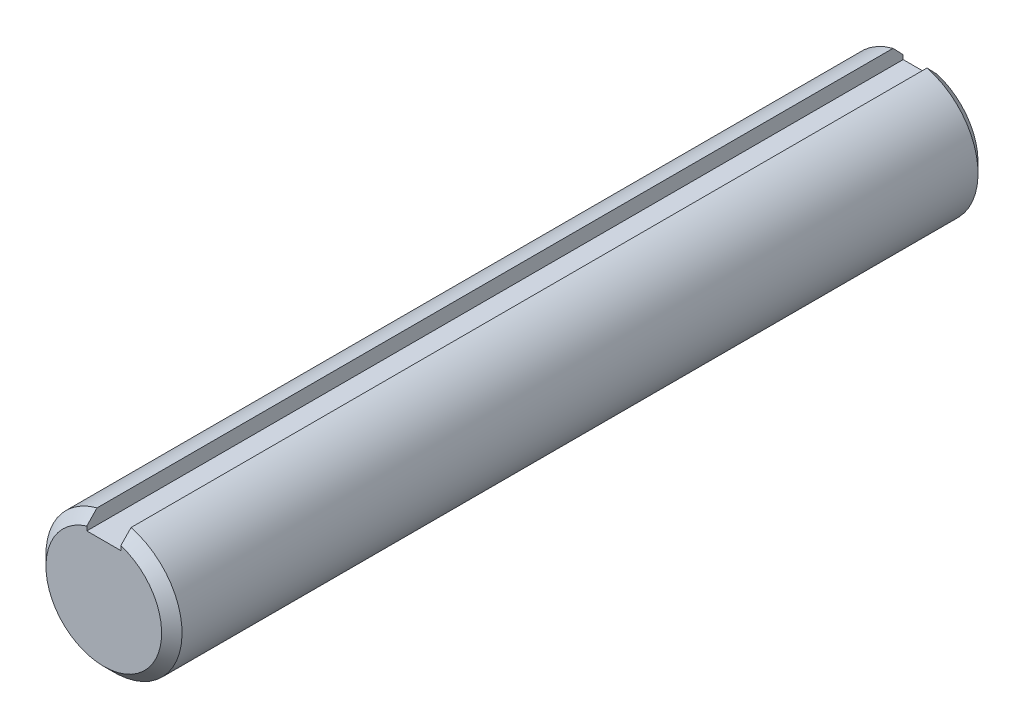
ISO-10303-21;
HEADER;
FILE_DESCRIPTION(('STEP AP214'),'2;1');
FILE_NAME('part.step','',(''),(''),'','','');
FILE_SCHEMA(('AUTOMOTIVE_DESIGN { 1 0 10303 214 1 1 1 1 }'));
ENDSEC;
DATA;
#1=APPLICATION_CONTEXT('core data for automotive mechanical design processes');
#2=APPLICATION_PROTOCOL_DEFINITION('international standard','automotive_design',2000,#1);
#3=PRODUCT_CONTEXT('',#1,'mechanical');
#4=PRODUCT('Part','Part','',(#3));
#5=PRODUCT_RELATED_PRODUCT_CATEGORY('part','',(#4));
#6=PRODUCT_DEFINITION_FORMATION('','',#4);
#7=PRODUCT_DEFINITION_CONTEXT('part definition',#1,'design');
#8=PRODUCT_DEFINITION('design','',#6,#7);
#9=PRODUCT_DEFINITION_SHAPE('','',#8);
#10=(LENGTH_UNIT() NAMED_UNIT(*) SI_UNIT(.MILLI.,.METRE.));
#11=(NAMED_UNIT(*) PLANE_ANGLE_UNIT() SI_UNIT($,.RADIAN.));
#12=(NAMED_UNIT(*) SI_UNIT($,.STERADIAN.) SOLID_ANGLE_UNIT());
#13=UNCERTAINTY_MEASURE_WITH_UNIT(LENGTH_MEASURE(1.E-05),#10,'distance_accuracy_value','');
#14=(GEOMETRIC_REPRESENTATION_CONTEXT(3) GLOBAL_UNCERTAINTY_ASSIGNED_CONTEXT((#13)) GLOBAL_UNIT_ASSIGNED_CONTEXT((#10,
#11,#12)) REPRESENTATION_CONTEXT('',''));
#15=CARTESIAN_POINT('',(0.,0.,0.));
#16=DIRECTION('',(0.,0.,1.));
#17=DIRECTION('',(1.,0.,0.));
#18=AXIS2_PLACEMENT_3D('',#15,#16,#17);
#19=CARTESIAN_POINT('',(0.,0.,76.2));
#20=DIRECTION('',(0.,0.,-1.));
#21=DIRECTION('',(-1.,0.,0.));
#22=AXIS2_PLACEMENT_3D('',#19,#20,#21);
#23=CYLINDRICAL_SURFACE('',#22,12.7);
#24=CARTESIAN_POINT('',(0.,0.,74.2950000000001));
#25=DIRECTION('',(0.,0.,1.));
#26=DIRECTION('',(1.,0.,0.));
#27=AXIS2_PLACEMENT_3D('',#24,#25,#26);
#28=CIRCLE('',#27,12.7);
#29=CARTESIAN_POINT('',(3.175,12.2967221242085,74.2950000000001));
#30=VERTEX_POINT('',#29);
#31=CARTESIAN_POINT('',(-3.175,12.2967221242085,74.2950000000001));
#32=VERTEX_POINT('',#31);
#33=EDGE_CURVE('E155',#30,#32,#28,.F.);
#34=ORIENTED_EDGE('',*,*,#33,.T.);
#35=DIRECTION('',(0.,0.,-1.));
#36=VECTOR('',#35,1.);
#37=CARTESIAN_POINT('',(-3.175,12.2967221242085,76.2));
#38=LINE('',#37,#36);
#39=CARTESIAN_POINT('',(-3.175,12.2967221242085,-74.2949999999998));
#40=VERTEX_POINT('',#39);
#41=EDGE_CURVE('E132',#32,#40,#38,.T.);
#42=ORIENTED_EDGE('',*,*,#41,.T.);
#43=CARTESIAN_POINT('',(0.,0.,-74.2949999999998));
#44=DIRECTION('',(0.,0.,1.));
#45=DIRECTION('',(1.,0.,0.));
#46=AXIS2_PLACEMENT_3D('',#43,#44,#45);
#47=CIRCLE('',#46,12.7);
#48=CARTESIAN_POINT('',(3.175,12.2967221242085,-74.2949999999998));
#49=VERTEX_POINT('',#48);
#50=EDGE_CURVE('E152',#40,#49,#47,.T.);
#51=ORIENTED_EDGE('',*,*,#50,.T.);
#52=DIRECTION('',(0.,0.,-1.));
#53=VECTOR('',#52,1.);
#54=CARTESIAN_POINT('',(3.175,12.2967221242085,76.2));
#55=LINE('',#54,#53);
#56=EDGE_CURVE('E121',#49,#30,#55,.F.);
#57=ORIENTED_EDGE('',*,*,#56,.T.);
#58=EDGE_LOOP('',(#34,#42,#51,#57));
#59=FACE_BOUND('',#58,.T.);
#60=ADVANCED_FACE('F35',(#59),#23,.T.);
#61=CARTESIAN_POINT('',(0.,0.,76.2));
#62=DIRECTION('',(0.,0.,1.));
#63=DIRECTION('',(1.,0.,0.));
#64=AXIS2_PLACEMENT_3D('',#61,#62,#63);
#65=PLANE('',#64);
#66=DIRECTION('',(0.,-1.,0.));
#67=VECTOR('',#66,1.);
#68=CARTESIAN_POINT('',(-3.175,12.7,76.2));
#69=LINE('',#68,#67);
#70=CARTESIAN_POINT('',(-3.175,10.3175287738877,76.2));
#71=VERTEX_POINT('',#70);
#72=CARTESIAN_POINT('',(-3.175,9.525,76.2));
#73=VERTEX_POINT('',#72);
#74=EDGE_CURVE('E91',#71,#73,#69,.T.);
#75=ORIENTED_EDGE('',*,*,#74,.F.);
#76=CARTESIAN_POINT('',(0.,0.,76.2));
#77=DIRECTION('',(0.,0.,1.));
#78=DIRECTION('',(1.,0.,0.));
#79=AXIS2_PLACEMENT_3D('',#76,#77,#78);
#80=CIRCLE('',#79,10.7950000000001);
#81=CARTESIAN_POINT('',(3.175,10.3175287738877,76.2));
#82=VERTEX_POINT('',#81);
#83=EDGE_CURVE('E147',#71,#82,#80,.T.);
#84=ORIENTED_EDGE('',*,*,#83,.T.);
#85=DIRECTION('',(0.,1.,0.));
#86=VECTOR('',#85,1.);
#87=CARTESIAN_POINT('',(3.175,12.7,76.2));
#88=LINE('',#87,#86);
#89=CARTESIAN_POINT('',(3.175,9.525,76.2));
#90=VERTEX_POINT('',#89);
#91=EDGE_CURVE('E56',#90,#82,#88,.T.);
#92=ORIENTED_EDGE('',*,*,#91,.F.);
#93=DIRECTION('',(1.,0.,0.));
#94=VECTOR('',#93,1.);
#95=CARTESIAN_POINT('',(-3.175,9.525,76.2));
#96=LINE('',#95,#94);
#97=EDGE_CURVE('E101',#73,#90,#96,.T.);
#98=ORIENTED_EDGE('',*,*,#97,.F.);
#99=EDGE_LOOP('',(#75,#84,#92,#98));
#100=FACE_BOUND('',#99,.T.);
#101=ADVANCED_FACE('F112',(#100),#65,.T.);
#102=CARTESIAN_POINT('',(0.,0.,-76.2));
#103=DIRECTION('',(0.,0.,1.));
#104=DIRECTION('',(1.,0.,0.));
#105=AXIS2_PLACEMENT_3D('',#102,#103,#104);
#106=PLANE('',#105);
#107=CARTESIAN_POINT('',(0.,0.,-76.2));
#108=DIRECTION('',(0.,0.,1.));
#109=DIRECTION('',(1.,0.,0.));
#110=AXIS2_PLACEMENT_3D('',#107,#108,#109);
#111=CIRCLE('',#110,10.7949999999998);
#112=CARTESIAN_POINT('',(3.175,10.3175287738875,-76.2));
#113=VERTEX_POINT('',#112);
#114=CARTESIAN_POINT('',(-3.175,10.3175287738875,-76.2));
#115=VERTEX_POINT('',#114);
#116=EDGE_CURVE('E149',#113,#115,#111,.F.);
#117=ORIENTED_EDGE('',*,*,#116,.T.);
#118=DIRECTION('',(0.,-1.,0.));
#119=VECTOR('',#118,1.);
#120=CARTESIAN_POINT('',(-3.175,12.7,-76.2));
#121=LINE('',#120,#119);
#122=CARTESIAN_POINT('',(-3.175,9.525,-76.2));
#123=VERTEX_POINT('',#122);
#124=EDGE_CURVE('E114',#115,#123,#121,.T.);
#125=ORIENTED_EDGE('',*,*,#124,.T.);
#126=DIRECTION('',(1.,0.,0.));
#127=VECTOR('',#126,1.);
#128=CARTESIAN_POINT('',(-3.175,9.525,-76.2));
#129=LINE('',#128,#127);
#130=CARTESIAN_POINT('',(3.175,9.525,-76.2));
#131=VERTEX_POINT('',#130);
#132=EDGE_CURVE('E107',#123,#131,#129,.T.);
#133=ORIENTED_EDGE('',*,*,#132,.T.);
#134=DIRECTION('',(0.,1.,0.));
#135=VECTOR('',#134,1.);
#136=CARTESIAN_POINT('',(3.175,12.7,-76.2));
#137=LINE('',#136,#135);
#138=EDGE_CURVE('E110',#131,#113,#137,.T.);
#139=ORIENTED_EDGE('',*,*,#138,.T.);
#140=EDGE_LOOP('',(#117,#125,#133,#139));
#141=FACE_BOUND('',#140,.T.);
#142=ADVANCED_FACE('F167',(#141),#106,.F.);
#143=CARTESIAN_POINT('',(0.,0.,-74.2949999999998));
#144=DIRECTION('',(0.,0.,1.));
#145=DIRECTION('',(1.,0.,0.));
#146=AXIS2_PLACEMENT_3D('',#143,#144,#145);
#147=CONICAL_SURFACE('',#146,12.7,0.785398163397448);
#148=CARTESIAN_POINT('',(-3.175,5.00937173024075,-81.0641965020128));
#149=CARTESIAN_POINT('',(-3.175,5.12467963968383,-80.9667945387005));
#150=CARTESIAN_POINT('',(-3.175,5.23951989911789,-80.8688422076214));
#151=CARTESIAN_POINT('',(-3.175,5.4683842175949,-80.6719927371281));
#152=CARTESIAN_POINT('',(-3.175,5.58240829263712,-80.5730956163234));
#153=CARTESIAN_POINT('',(-3.175,5.92342458066597,-80.2752300814577));
#154=CARTESIAN_POINT('',(-3.175,6.14937813584772,-80.0750728218668));
#155=CARTESIAN_POINT('',(-3.175,6.59915683005555,-79.672467988588));
#156=CARTESIAN_POINT('',(-3.175,6.82298234160733,-79.4700208298712));
#157=CARTESIAN_POINT('',(-3.175,7.26902629652598,-79.063355753249));
#158=CARTESIAN_POINT('',(-3.175,7.49124470438248,-78.859137796434));
#159=CARTESIAN_POINT('',(-3.175,7.93435772993716,-78.4493841377801));
#160=CARTESIAN_POINT('',(-3.175,8.15525266801079,-78.2438487820276));
#161=CARTESIAN_POINT('',(-3.175,8.59602457036934,-77.8316936733903));
#162=CARTESIAN_POINT('',(-3.175,8.81590154254233,-77.6250739289348));
#163=CARTESIAN_POINT('',(-3.175,9.47432927903641,-77.0038925911444));
#164=CARTESIAN_POINT('',(-3.175,9.91165318678532,-76.5880308797349));
#165=CARTESIAN_POINT('',(-3.175,10.7839479781506,-75.7540960721043));
#166=CARTESIAN_POINT('',(-3.175,11.2189194878173,-75.3360236294023));
#167=CARTESIAN_POINT('',(-3.175,12.0872516822017,-74.4982293401121));
#168=CARTESIAN_POINT('',(-3.175,12.5206124025178,-74.0785075304016));
#169=CARTESIAN_POINT('',(-3.175,13.3862448514882,-73.2377647067747));
#170=CARTESIAN_POINT('',(-3.175,13.8185163366833,-72.816743442379));
#171=CARTESIAN_POINT('',(-3.175,14.682154105112,-71.9737580064372));
#172=CARTESIAN_POINT('',(-3.175,15.1135203721463,-71.5517938182914));
#173=CARTESIAN_POINT('',(-3.175,15.5445632058881,-71.1295006299248));
#174=B_SPLINE_CURVE_WITH_KNOTS('',3,(#148,#149,#150,#151,#152,#153,#154,#155,#156,#157,#158,
#159,#160,#161,#162,#163,#164,#165,#166,#167,#168,#169,#170,#171,#172,#173),.UNSPECIFIED.,.F.,
.F.,(4,2,2,2,2,2,2,2,2,2,2,2,4),(0.,0.452816810908768,0.905624721024884,1.81117254191708,
2.71655880973215,3.62196502210452,4.52714240548244,5.43231276298767,7.24275040676511,
9.05267984842245,10.8625690499397,12.6728321405143,14.4831273549283),.UNSPECIFIED.);
#175=EDGE_CURVE('E64',#115,#40,#174,.T.);
#176=ORIENTED_EDGE('',*,*,#175,.F.);
#177=ORIENTED_EDGE('',*,*,#116,.F.);
#178=CARTESIAN_POINT('',(3.175,15.5445632058881,-71.1295006299248));
#179=CARTESIAN_POINT('',(3.175,15.1135203721463,-71.5517938182914));
#180=CARTESIAN_POINT('',(3.175,14.682154105112,-71.9737580064372));
#181=CARTESIAN_POINT('',(3.175,13.8185163366833,-72.816743442379));
#182=CARTESIAN_POINT('',(3.175,13.3862448514882,-73.2377647067747));
#183=CARTESIAN_POINT('',(3.175,12.5206124025178,-74.0785075304016));
#184=CARTESIAN_POINT('',(3.175,12.0872516822017,-74.4982293401121));
#185=CARTESIAN_POINT('',(3.175,11.2189194878173,-75.3360236294023));
#186=CARTESIAN_POINT('',(3.175,10.7839479781506,-75.7540960721043));
#187=CARTESIAN_POINT('',(3.175,9.91165318678532,-76.5880308797349));
#188=CARTESIAN_POINT('',(3.175,9.47432927903641,-77.0038925911444));
#189=CARTESIAN_POINT('',(3.175,8.81590154254233,-77.6250739289348));
#190=CARTESIAN_POINT('',(3.175,8.59602457036934,-77.8316936733903));
#191=CARTESIAN_POINT('',(3.175,8.15525266801079,-78.2438487820276));
#192=CARTESIAN_POINT('',(3.175,7.93435772993716,-78.4493841377801));
#193=CARTESIAN_POINT('',(3.175,7.49124470438248,-78.859137796434));
#194=CARTESIAN_POINT('',(3.175,7.26902629652599,-79.063355753249));
#195=CARTESIAN_POINT('',(3.175,6.82298234160734,-79.4700208298712));
#196=CARTESIAN_POINT('',(3.175,6.59915683005556,-79.672467988588));
#197=CARTESIAN_POINT('',(3.175,6.14937813584772,-80.0750728218668));
#198=CARTESIAN_POINT('',(3.175,5.92342458066597,-80.2752300814577));
#199=CARTESIAN_POINT('',(3.175,5.58240829263712,-80.5730956163234));
#200=CARTESIAN_POINT('',(3.175,5.4683842175949,-80.6719927371281));
#201=CARTESIAN_POINT('',(3.175,5.23951989911789,-80.8688422076214));
#202=CARTESIAN_POINT('',(3.175,5.12467963968383,-80.9667945387005));
#203=CARTESIAN_POINT('',(3.175,5.00937173024075,-81.0641965020128));
#204=B_SPLINE_CURVE_WITH_KNOTS('',3,(#178,#179,#180,#181,#182,#183,#184,#185,#186,#187,#188,
#189,#190,#191,#192,#193,#194,#195,#196,#197,#198,#199,#200,#201,#202,#203),.UNSPECIFIED.,.F.,
.F.,(4,2,2,2,2,2,2,2,2,2,2,2,4),(0.,1.810295214414,3.62055830498865,5.43044750650587,
7.2403769481632,9.05081459194064,9.95598494944589,10.8611623328238,11.7665685451961,
12.6719548130112,13.5775026339034,14.0303105440195,14.4831273549283),.UNSPECIFIED.);
#205=EDGE_CURVE('E125',#49,#113,#204,.T.);
#206=ORIENTED_EDGE('',*,*,#205,.F.);
#207=ORIENTED_EDGE('',*,*,#50,.F.);
#208=EDGE_LOOP('',(#176,#177,#206,#207));
#209=FACE_BOUND('',#208,.T.);
#210=ADVANCED_FACE('F134',(#209),#147,.T.);
#211=CARTESIAN_POINT('',(0.,0.,76.2));
#212=DIRECTION('',(0.,0.,-1.));
#213=DIRECTION('',(-1.,0.,0.));
#214=AXIS2_PLACEMENT_3D('',#211,#212,#213);
#215=CONICAL_SURFACE('',#214,10.7950000000001,0.785398163397448);
#216=CARTESIAN_POINT('',(-3.175,15.5445632058881,71.129500629925));
#217=CARTESIAN_POINT('',(-3.175,15.1135203721463,71.5517938182916));
#218=CARTESIAN_POINT('',(-3.175,14.682154105112,71.9737580064374));
#219=CARTESIAN_POINT('',(-3.175,13.8185163366833,72.8167434423792));
#220=CARTESIAN_POINT('',(-3.175,13.3862448514883,73.2377647067749));
#221=CARTESIAN_POINT('',(-3.175,12.5206124025179,74.0785075304018));
#222=CARTESIAN_POINT('',(-3.175,12.0872516822017,74.4982293401123));
#223=CARTESIAN_POINT('',(-3.175,11.2189194878174,75.3360236294025));
#224=CARTESIAN_POINT('',(-3.175,10.7839479781507,75.7540960721045));
#225=CARTESIAN_POINT('',(-3.175,9.91165318678543,76.588030879735));
#226=CARTESIAN_POINT('',(-3.175,9.47432927903653,77.0038925911446));
#227=CARTESIAN_POINT('',(-3.175,8.81590154254245,77.6250739289349));
#228=CARTESIAN_POINT('',(-3.175,8.59602457036946,77.8316936733904));
#229=CARTESIAN_POINT('',(-3.175,8.15525266801093,78.2438487820277));
#230=CARTESIAN_POINT('',(-3.175,7.9343577299373,78.4493841377802));
#231=CARTESIAN_POINT('',(-3.175,7.49124470438264,78.8591377964341));
#232=CARTESIAN_POINT('',(-3.175,7.26902629652615,79.063355753249));
#233=CARTESIAN_POINT('',(-3.175,6.82298234160751,79.4700208298713));
#234=CARTESIAN_POINT('',(-3.175,6.59915683005574,79.6724679885881));
#235=CARTESIAN_POINT('',(-3.175,6.14937813584791,80.0750728218669));
#236=CARTESIAN_POINT('',(-3.175,5.92342458066618,80.2752300814578));
#237=CARTESIAN_POINT('',(-3.175,5.58240829263733,80.5730956163234));
#238=CARTESIAN_POINT('',(-3.175,5.46838421759512,80.6719927371281));
#239=CARTESIAN_POINT('',(-3.175,5.23951989911811,80.8688422076214));
#240=CARTESIAN_POINT('',(-3.175,5.12467963968405,80.9667945387005));
#241=CARTESIAN_POINT('',(-3.175,5.00937173024097,81.0641965020128));
#242=B_SPLINE_CURVE_WITH_KNOTS('',3,(#216,#217,#218,#219,#220,#221,#222,#223,#224,#225,#226,
#227,#228,#229,#230,#231,#232,#233,#234,#235,#236,#237,#238,#239,#240,#241),.UNSPECIFIED.,.F.,
.F.,(4,2,2,2,2,2,2,2,2,2,2,2,4),(0.,1.81029521441397,3.62055830498857,5.43044750650574,
7.24037694816304,9.05081459194046,9.95598494944568,10.8611623328236,11.7665685451959,
12.671954813011,13.5775026339031,14.0303105440192,14.483127354928),.UNSPECIFIED.);
#243=EDGE_CURVE('E11',#32,#71,#242,.T.);
#244=ORIENTED_EDGE('',*,*,#243,.F.);
#245=ORIENTED_EDGE('',*,*,#33,.F.);
#246=CARTESIAN_POINT('',(3.175,5.00937173024097,81.0641965020128));
#247=CARTESIAN_POINT('',(3.175,5.12467963968405,80.9667945387005));
#248=CARTESIAN_POINT('',(3.175,5.23951989911811,80.8688422076214));
#249=CARTESIAN_POINT('',(3.175,5.46838421759512,80.6719927371281));
#250=CARTESIAN_POINT('',(3.175,5.58240829263733,80.5730956163234));
#251=CARTESIAN_POINT('',(3.175,5.92342458066618,80.2752300814578));
#252=CARTESIAN_POINT('',(3.175,6.14937813584791,80.0750728218669));
#253=CARTESIAN_POINT('',(3.175,6.59915683005574,79.6724679885881));
#254=CARTESIAN_POINT('',(3.175,6.82298234160752,79.4700208298713));
#255=CARTESIAN_POINT('',(3.175,7.26902629652615,79.063355753249));
#256=CARTESIAN_POINT('',(3.175,7.49124470438265,78.8591377964341));
#257=CARTESIAN_POINT('',(3.175,7.9343577299373,78.4493841377802));
#258=CARTESIAN_POINT('',(3.175,8.15525266801092,78.2438487820277));
#259=CARTESIAN_POINT('',(3.175,8.59602457036946,77.8316936733904));
#260=CARTESIAN_POINT('',(3.175,8.81590154254245,77.625073928935));
#261=CARTESIAN_POINT('',(3.175,9.47432927903652,77.0038925911446));
#262=CARTESIAN_POINT('',(3.175,9.91165318678543,76.588030879735));
#263=CARTESIAN_POINT('',(3.175,10.7839479781507,75.7540960721045));
#264=CARTESIAN_POINT('',(3.175,11.2189194878174,75.3360236294025));
#265=CARTESIAN_POINT('',(3.175,12.0872516822017,74.4982293401123));
#266=CARTESIAN_POINT('',(3.175,12.5206124025179,74.0785075304018));
#267=CARTESIAN_POINT('',(3.175,13.3862448514883,73.2377647067749));
#268=CARTESIAN_POINT('',(3.175,13.8185163366833,72.8167434423792));
#269=CARTESIAN_POINT('',(3.175,14.682154105112,71.9737580064374));
#270=CARTESIAN_POINT('',(3.175,15.1135203721463,71.5517938182916));
#271=CARTESIAN_POINT('',(3.175,15.5445632058881,71.129500629925));
#272=B_SPLINE_CURVE_WITH_KNOTS('',3,(#246,#247,#248,#249,#250,#251,#252,#253,#254,#255,#256,
#257,#258,#259,#260,#261,#262,#263,#264,#265,#266,#267,#268,#269,#270,#271),.UNSPECIFIED.,.F.,
.F.,(4,2,2,2,2,2,2,2,2,2,2,2,4),(0.,0.452816810908762,0.90562472102486,1.81117254191703,
2.71655880973211,3.62196502210444,4.5271424054823,5.43231276298754,7.24275040676495,
9.05267984842226,10.8625690499394,12.672832140514,14.483127354928),.UNSPECIFIED.);
#273=EDGE_CURVE('E49',#82,#30,#272,.T.);
#274=ORIENTED_EDGE('',*,*,#273,.F.);
#275=ORIENTED_EDGE('',*,*,#83,.F.);
#276=EDGE_LOOP('',(#244,#245,#274,#275));
#277=FACE_BOUND('',#276,.T.);
#278=ADVANCED_FACE('F37',(#277),#215,.T.);
#279=CARTESIAN_POINT('',(-3.175,12.7,-76.2));
#280=DIRECTION('',(-1.,0.,0.));
#281=DIRECTION('',(0.,0.,1.));
#282=AXIS2_PLACEMENT_3D('',#279,#280,#281);
#283=PLANE('',#282);
#284=ORIENTED_EDGE('',*,*,#175,.T.);
#285=ORIENTED_EDGE('',*,*,#41,.F.);
#286=ORIENTED_EDGE('',*,*,#243,.T.);
#287=ORIENTED_EDGE('',*,*,#74,.T.);
#288=DIRECTION('',(0.,0.,1.));
#289=VECTOR('',#288,1.);
#290=CARTESIAN_POINT('',(-3.175,9.525,-76.2));
#291=LINE('',#290,#289);
#292=EDGE_CURVE('E94',#123,#73,#291,.T.);
#293=ORIENTED_EDGE('',*,*,#292,.F.);
#294=ORIENTED_EDGE('',*,*,#124,.F.);
#295=EDGE_LOOP('',(#284,#285,#286,#287,#293,#294));
#296=FACE_BOUND('',#295,.T.);
#297=ADVANCED_FACE('F93',(#296),#283,.F.);
#298=CARTESIAN_POINT('',(3.175,12.7,-76.2));
#299=DIRECTION('',(1.,0.,0.));
#300=DIRECTION('',(0.,0.,-1.));
#301=AXIS2_PLACEMENT_3D('',#298,#299,#300);
#302=PLANE('',#301);
#303=ORIENTED_EDGE('',*,*,#205,.T.);
#304=ORIENTED_EDGE('',*,*,#138,.F.);
#305=DIRECTION('',(0.,0.,1.));
#306=VECTOR('',#305,1.);
#307=CARTESIAN_POINT('',(3.175,9.525,-76.2));
#308=LINE('',#307,#306);
#309=EDGE_CURVE('E109',#131,#90,#308,.T.);
#310=ORIENTED_EDGE('',*,*,#309,.T.);
#311=ORIENTED_EDGE('',*,*,#91,.T.);
#312=ORIENTED_EDGE('',*,*,#273,.T.);
#313=ORIENTED_EDGE('',*,*,#56,.F.);
#314=EDGE_LOOP('',(#303,#304,#310,#311,#312,#313));
#315=FACE_BOUND('',#314,.T.);
#316=ADVANCED_FACE('F137',(#315),#302,.F.);
#317=CARTESIAN_POINT('',(-3.175,9.525,-76.2));
#318=DIRECTION('',(0.,-1.,0.));
#319=DIRECTION('',(0.,0.,-1.));
#320=AXIS2_PLACEMENT_3D('',#317,#318,#319);
#321=PLANE('',#320);
#322=ORIENTED_EDGE('',*,*,#309,.F.);
#323=ORIENTED_EDGE('',*,*,#132,.F.);
#324=ORIENTED_EDGE('',*,*,#292,.T.);
#325=ORIENTED_EDGE('',*,*,#97,.T.);
#326=EDGE_LOOP('',(#322,#323,#324,#325));
#327=FACE_BOUND('',#326,.T.);
#328=ADVANCED_FACE('F105',(#327),#321,.F.);
#329=CLOSED_SHELL('',(#60,#101,#142,#210,#278,#297,#316,#328));
#330=MANIFOLD_SOLID_BREP('B2',#329);
#331=ADVANCED_BREP_SHAPE_REPRESENTATION('',(#18,#330),#14);
#332=SHAPE_DEFINITION_REPRESENTATION(#9,#331);
ENDSEC;
END-ISO-10303-21;
